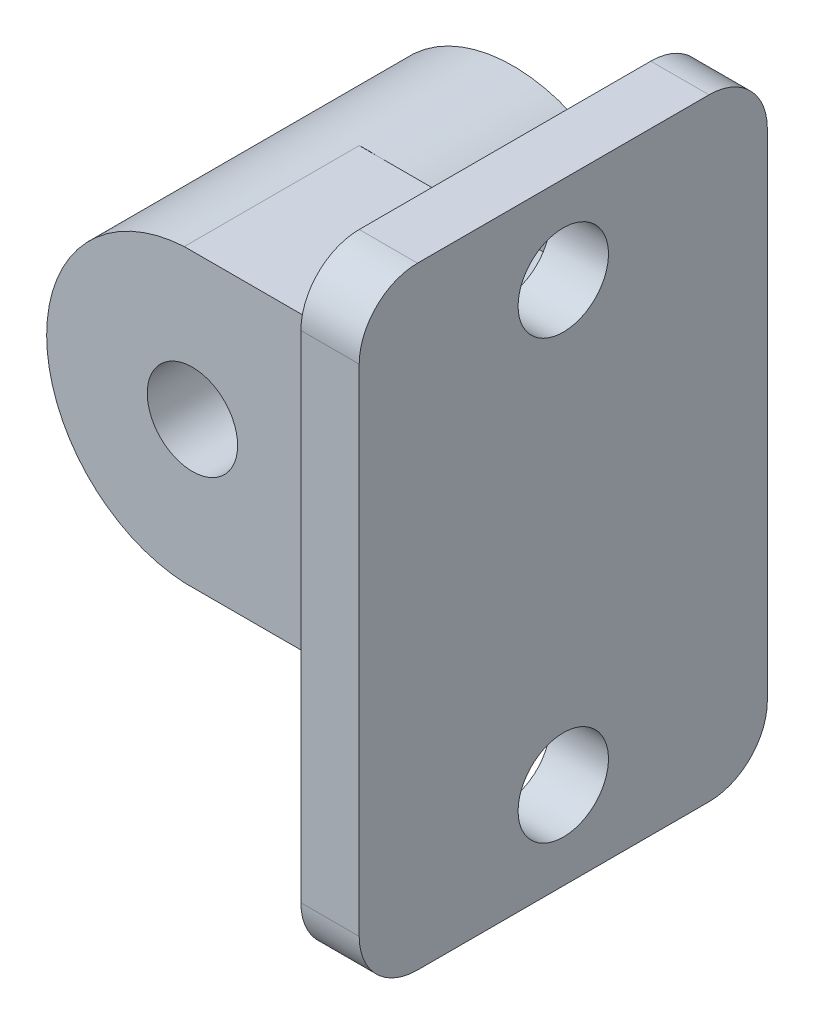
ISO-10303-21;
HEADER;
FILE_DESCRIPTION(('STEP AP214'),'2;1');
FILE_NAME('part.step','',(''),(''),'','','');
FILE_SCHEMA(('AUTOMOTIVE_DESIGN { 1 0 10303 214 1 1 1 1 }'));
ENDSEC;
DATA;
#1=APPLICATION_CONTEXT('core data for automotive mechanical design processes');
#2=APPLICATION_PROTOCOL_DEFINITION('international standard','automotive_design',2000,#1);
#3=PRODUCT_CONTEXT('',#1,'mechanical');
#4=PRODUCT('Part','Part','',(#3));
#5=PRODUCT_RELATED_PRODUCT_CATEGORY('part','',(#4));
#6=PRODUCT_DEFINITION_FORMATION('','',#4);
#7=PRODUCT_DEFINITION_CONTEXT('part definition',#1,'design');
#8=PRODUCT_DEFINITION('design','',#6,#7);
#9=PRODUCT_DEFINITION_SHAPE('','',#8);
#10=(LENGTH_UNIT() NAMED_UNIT(*) SI_UNIT(.MILLI.,.METRE.));
#11=(NAMED_UNIT(*) PLANE_ANGLE_UNIT() SI_UNIT($,.RADIAN.));
#12=(NAMED_UNIT(*) SI_UNIT($,.STERADIAN.) SOLID_ANGLE_UNIT());
#13=UNCERTAINTY_MEASURE_WITH_UNIT(LENGTH_MEASURE(1.E-05),#10,'distance_accuracy_value','');
#14=(GEOMETRIC_REPRESENTATION_CONTEXT(3) GLOBAL_UNCERTAINTY_ASSIGNED_CONTEXT((#13)) GLOBAL_UNIT_ASSIGNED_CONTEXT((#10,
#11,#12)) REPRESENTATION_CONTEXT('',''));
#15=CARTESIAN_POINT('',(0.,0.,0.));
#16=DIRECTION('',(0.,0.,1.));
#17=DIRECTION('',(1.,0.,0.));
#18=AXIS2_PLACEMENT_3D('',#15,#16,#17);
#19=CARTESIAN_POINT('',(0.,0.,-3.));
#20=DIRECTION('',(0.,0.,1.));
#21=DIRECTION('',(1.,0.,0.));
#22=AXIS2_PLACEMENT_3D('',#19,#20,#21);
#23=CYLINDRICAL_SURFACE('',#22,5.00000000000007);
#24=DIRECTION('',(0.,0.,1.));
#25=VECTOR('',#24,1.);
#26=CARTESIAN_POINT('',(-0.27924201066269,-4.99219630017508,-3.));
#27=LINE('',#26,#25);
#28=CARTESIAN_POINT('',(-0.27924201066269,-4.99219630017508,-3.));
#29=VERTEX_POINT('',#28);
#30=CARTESIAN_POINT('',(-0.27924201066269,-4.99219630017508,3.));
#31=VERTEX_POINT('',#30);
#32=EDGE_CURVE('E168',#29,#31,#27,.T.);
#33=ORIENTED_EDGE('',*,*,#32,.T.);
#34=CARTESIAN_POINT('',(0.,0.,3.));
#35=DIRECTION('',(0.,0.,1.));
#36=DIRECTION('',(1.,0.,0.));
#37=AXIS2_PLACEMENT_3D('',#34,#35,#36);
#38=CIRCLE('',#37,5.00000000000007);
#39=CARTESIAN_POINT('',(-0.27924201066269,4.99219630017508,3.));
#40=VERTEX_POINT('',#39);
#41=EDGE_CURVE('E155',#40,#31,#38,.T.);
#42=ORIENTED_EDGE('',*,*,#41,.F.);
#43=DIRECTION('',(0.,0.,1.));
#44=VECTOR('',#43,1.);
#45=CARTESIAN_POINT('',(-0.27924201066269,4.99219630017508,-3.));
#46=LINE('',#45,#44);
#47=CARTESIAN_POINT('',(-0.27924201066269,4.99219630017508,-3.));
#48=VERTEX_POINT('',#47);
#49=EDGE_CURVE('E146',#48,#40,#46,.T.);
#50=ORIENTED_EDGE('',*,*,#49,.F.);
#51=CARTESIAN_POINT('',(0.,0.,-3.));
#52=DIRECTION('',(0.,0.,1.));
#53=DIRECTION('',(1.,0.,0.));
#54=AXIS2_PLACEMENT_3D('',#51,#52,#53);
#55=CIRCLE('',#54,5.00000000000007);
#56=CARTESIAN_POINT('',(0.279242010662767,4.99219630017507,-3.));
#57=VERTEX_POINT('',#56);
#58=EDGE_CURVE('E54',#57,#48,#55,.T.);
#59=ORIENTED_EDGE('',*,*,#58,.F.);
#60=CARTESIAN_POINT('',(0.279242010662767,-4.99219630017507,-3.));
#61=VERTEX_POINT('',#60);
#62=EDGE_CURVE('E141',#61,#57,#55,.T.);
#63=ORIENTED_EDGE('',*,*,#62,.F.);
#64=EDGE_CURVE('E139',#29,#61,#55,.T.);
#65=ORIENTED_EDGE('',*,*,#64,.F.);
#66=EDGE_LOOP('',(#33,#42,#50,#59,#63,#65));
#67=FACE_BOUND('',#66,.T.);
#68=CARTESIAN_POINT('',(0.,0.,-8.));
#69=DIRECTION('',(0.,0.,1.));
#70=DIRECTION('',(1.,0.,0.));
#71=AXIS2_PLACEMENT_3D('',#68,#69,#70);
#72=CIRCLE('',#71,5.00000000000007);
#73=CARTESIAN_POINT('',(5.00000000000007,0.,-8.));
#74=VERTEX_POINT('',#73);
#75=EDGE_CURVE('E138',#74,#74,#72,.T.);
#76=ORIENTED_EDGE('',*,*,#75,.T.);
#77=EDGE_LOOP('',(#76));
#78=FACE_BOUND('',#77,.T.);
#79=ADVANCED_FACE('F39',(#67,#78),#23,.T.);
#80=CARTESIAN_POINT('',(-0.27924201066269,4.99219630017508,-3.));
#81=DIRECTION('',(0.,1.,0.));
#82=DIRECTION('',(-1.,0.,0.));
#83=AXIS2_PLACEMENT_3D('',#80,#81,#82);
#84=PLANE('',#83);
#85=ORIENTED_EDGE('',*,*,#49,.T.);
#86=DIRECTION('',(-1.,0.,0.));
#87=VECTOR('',#86,1.);
#88=CARTESIAN_POINT('',(-0.27924201066269,4.99219630017508,3.));
#89=LINE('',#88,#87);
#90=CARTESIAN_POINT('',(7.72075798933731,4.99219630017501,3.));
#91=VERTEX_POINT('',#90);
#92=EDGE_CURVE('E245',#91,#40,#89,.T.);
#93=ORIENTED_EDGE('',*,*,#92,.F.);
#94=DIRECTION('',(0.,0.,1.));
#95=VECTOR('',#94,1.);
#96=CARTESIAN_POINT('',(7.72075798933731,4.99219630017501,-3.));
#97=LINE('',#96,#95);
#98=CARTESIAN_POINT('',(7.72075798933731,4.99219630017501,-3.));
#99=VERTEX_POINT('',#98);
#100=EDGE_CURVE('E157',#99,#91,#97,.T.);
#101=ORIENTED_EDGE('',*,*,#100,.F.);
#102=DIRECTION('',(-1.,0.,0.));
#103=VECTOR('',#102,1.);
#104=CARTESIAN_POINT('',(-0.27924201066269,4.99219630017508,-3.));
#105=LINE('',#104,#103);
#106=EDGE_CURVE('E149',#99,#57,#105,.T.);
#107=ORIENTED_EDGE('',*,*,#106,.T.);
#108=DIRECTION('',(1.,0.,0.));
#109=VECTOR('',#108,1.);
#110=CARTESIAN_POINT('',(-0.27924201066269,4.99219630017508,-3.));
#111=LINE('',#110,#109);
#112=EDGE_CURVE('E136',#48,#57,#111,.T.);
#113=ORIENTED_EDGE('',*,*,#112,.F.);
#114=EDGE_LOOP('',(#85,#93,#101,#107,#113));
#115=FACE_BOUND('',#114,.T.);
#116=ADVANCED_FACE('F144',(#115),#84,.T.);
#117=CARTESIAN_POINT('',(-0.27924201066269,-4.99219630017508,-3.));
#118=DIRECTION('',(0.,-1.,0.));
#119=DIRECTION('',(1.,0.,0.));
#120=AXIS2_PLACEMENT_3D('',#117,#118,#119);
#121=PLANE('',#120);
#122=DIRECTION('',(0.,0.,1.));
#123=VECTOR('',#122,1.);
#124=CARTESIAN_POINT('',(7.72075798933731,-4.99219630017501,-3.));
#125=LINE('',#124,#123);
#126=CARTESIAN_POINT('',(7.72075798933731,-4.99219630017501,-3.));
#127=VERTEX_POINT('',#126);
#128=CARTESIAN_POINT('',(7.72075798933731,-4.99219630017501,3.));
#129=VERTEX_POINT('',#128);
#130=EDGE_CURVE('E162',#127,#129,#125,.T.);
#131=ORIENTED_EDGE('',*,*,#130,.T.);
#132=DIRECTION('',(1.,0.,0.));
#133=VECTOR('',#132,1.);
#134=CARTESIAN_POINT('',(-0.27924201066269,-4.99219630017508,3.));
#135=LINE('',#134,#133);
#136=EDGE_CURVE('E240',#31,#129,#135,.T.);
#137=ORIENTED_EDGE('',*,*,#136,.F.);
#138=ORIENTED_EDGE('',*,*,#32,.F.);
#139=DIRECTION('',(1.,0.,0.));
#140=VECTOR('',#139,1.);
#141=CARTESIAN_POINT('',(-0.27924201066269,-4.99219630017508,-3.));
#142=LINE('',#141,#140);
#143=EDGE_CURVE('E248',#29,#61,#142,.T.);
#144=ORIENTED_EDGE('',*,*,#143,.T.);
#145=EDGE_CURVE('E247',#61,#127,#142,.T.);
#146=ORIENTED_EDGE('',*,*,#145,.T.);
#147=EDGE_LOOP('',(#131,#137,#138,#144,#146));
#148=FACE_BOUND('',#147,.T.);
#149=ADVANCED_FACE('F265',(#148),#121,.T.);
#150=CARTESIAN_POINT('',(0.,0.,-3.));
#151=DIRECTION('',(0.,0.,1.));
#152=DIRECTION('',(1.,0.,0.));
#153=AXIS2_PLACEMENT_3D('',#150,#151,#152);
#154=PLANE('',#153);
#155=ORIENTED_EDGE('',*,*,#145,.F.);
#156=ORIENTED_EDGE('',*,*,#62,.T.);
#157=ORIENTED_EDGE('',*,*,#106,.F.);
#158=DIRECTION('',(0.,1.,0.));
#159=VECTOR('',#158,1.);
#160=CARTESIAN_POINT('',(7.72075798933731,4.99219630017501,-3.));
#161=LINE('',#160,#159);
#162=EDGE_CURVE('E250',#127,#99,#161,.T.);
#163=ORIENTED_EDGE('',*,*,#162,.F.);
#164=EDGE_LOOP('',(#155,#156,#157,#163));
#165=FACE_BOUND('',#164,.T.);
#166=ADVANCED_FACE('F258',(#165),#154,.F.);
#167=CARTESIAN_POINT('',(0.,0.,-3.));
#168=DIRECTION('',(0.,0.,1.));
#169=DIRECTION('',(1.,0.,0.));
#170=AXIS2_PLACEMENT_3D('',#167,#168,#169);
#171=CYLINDRICAL_SURFACE('',#170,1.55);
#172=CARTESIAN_POINT('',(0.,0.,3.));
#173=DIRECTION('',(0.,0.,1.));
#174=DIRECTION('',(1.,0.,0.));
#175=AXIS2_PLACEMENT_3D('',#172,#173,#174);
#176=CIRCLE('',#175,1.55);
#177=CARTESIAN_POINT('',(1.55,0.,3.));
#178=VERTEX_POINT('',#177);
#179=EDGE_CURVE('E235',#178,#178,#176,.T.);
#180=ORIENTED_EDGE('',*,*,#179,.T.);
#181=EDGE_LOOP('',(#180));
#182=FACE_BOUND('',#181,.T.);
#183=CARTESIAN_POINT('',(0.,0.,-8.));
#184=DIRECTION('',(0.,0.,1.));
#185=DIRECTION('',(1.,0.,0.));
#186=AXIS2_PLACEMENT_3D('',#183,#184,#185);
#187=CIRCLE('',#186,1.55);
#188=CARTESIAN_POINT('',(1.55,0.,-8.));
#189=VERTEX_POINT('',#188);
#190=EDGE_CURVE('E270',#189,#189,#187,.T.);
#191=ORIENTED_EDGE('',*,*,#190,.F.);
#192=EDGE_LOOP('',(#191));
#193=FACE_BOUND('',#192,.T.);
#194=ADVANCED_FACE('F327',(#182,#193),#171,.F.);
#195=CARTESIAN_POINT('',(0.,0.,3.));
#196=DIRECTION('',(0.,0.,1.));
#197=DIRECTION('',(1.,0.,0.));
#198=AXIS2_PLACEMENT_3D('',#195,#196,#197);
#199=PLANE('',#198);
#200=ORIENTED_EDGE('',*,*,#41,.T.);
#201=ORIENTED_EDGE('',*,*,#136,.T.);
#202=DIRECTION('',(0.,1.,0.));
#203=VECTOR('',#202,1.);
#204=CARTESIAN_POINT('',(7.72075798933731,4.99219630017501,3.));
#205=LINE('',#204,#203);
#206=EDGE_CURVE('E243',#129,#91,#205,.T.);
#207=ORIENTED_EDGE('',*,*,#206,.T.);
#208=ORIENTED_EDGE('',*,*,#92,.T.);
#209=EDGE_LOOP('',(#200,#201,#207,#208));
#210=FACE_BOUND('',#209,.T.);
#211=ORIENTED_EDGE('',*,*,#179,.F.);
#212=EDGE_LOOP('',(#211));
#213=FACE_BOUND('',#212,.T.);
#214=ADVANCED_FACE('F260',(#210,#213),#199,.T.);
#215=CARTESIAN_POINT('',(9.72075798933731,-10.5,-7.));
#216=DIRECTION('',(0.,0.,1.));
#217=DIRECTION('',(1.,0.,0.));
#218=AXIS2_PLACEMENT_3D('',#215,#216,#217);
#219=PLANE('',#218);
#220=DIRECTION('',(0.,1.,0.));
#221=VECTOR('',#220,1.);
#222=CARTESIAN_POINT('',(9.72075798933731,-10.5,-7.));
#223=LINE('',#222,#221);
#224=CARTESIAN_POINT('',(9.72075798933731,-8.5,-7.));
#225=VERTEX_POINT('',#224);
#226=CARTESIAN_POINT('',(9.72075798933731,8.5,-7.));
#227=VERTEX_POINT('',#226);
#228=EDGE_CURVE('E202',#225,#227,#223,.T.);
#229=ORIENTED_EDGE('',*,*,#228,.F.);
#230=DIRECTION('',(-1.,0.,0.));
#231=VECTOR('',#230,1.);
#232=CARTESIAN_POINT('',(9.72075798933731,-8.5,-7.));
#233=LINE('',#232,#231);
#234=CARTESIAN_POINT('',(7.72075798933731,-8.5,-7.));
#235=VERTEX_POINT('',#234);
#236=EDGE_CURVE('E12',#225,#235,#233,.T.);
#237=ORIENTED_EDGE('',*,*,#236,.T.);
#238=DIRECTION('',(0.,1.,0.));
#239=VECTOR('',#238,1.);
#240=CARTESIAN_POINT('',(7.72075798933731,-10.5,-7.));
#241=LINE('',#240,#239);
#242=CARTESIAN_POINT('',(7.72075798933731,8.5,-7.));
#243=VERTEX_POINT('',#242);
#244=EDGE_CURVE('E205',#235,#243,#241,.T.);
#245=ORIENTED_EDGE('',*,*,#244,.T.);
#246=DIRECTION('',(-1.,0.,0.));
#247=VECTOR('',#246,1.);
#248=CARTESIAN_POINT('',(9.72075798933731,8.50000000000001,-7.));
#249=LINE('',#248,#247);
#250=EDGE_CURVE('E47',#243,#227,#249,.F.);
#251=ORIENTED_EDGE('',*,*,#250,.T.);
#252=EDGE_LOOP('',(#229,#237,#245,#251));
#253=FACE_BOUND('',#252,.T.);
#254=ADVANCED_FACE('F201',(#253),#219,.F.);
#255=CARTESIAN_POINT('',(9.72075798933731,10.5,7.));
#256=DIRECTION('',(0.,-1.,0.));
#257=DIRECTION('',(0.,0.,-1.));
#258=AXIS2_PLACEMENT_3D('',#255,#256,#257);
#259=PLANE('',#258);
#260=DIRECTION('',(0.,0.,1.));
#261=VECTOR('',#260,1.);
#262=CARTESIAN_POINT('',(7.72075798933731,10.5,7.));
#263=LINE('',#262,#261);
#264=CARTESIAN_POINT('',(7.72075798933731,10.5,-5.));
#265=VERTEX_POINT('',#264);
#266=CARTESIAN_POINT('',(7.72075798933731,10.5,5.));
#267=VERTEX_POINT('',#266);
#268=EDGE_CURVE('E221',#265,#267,#263,.T.);
#269=ORIENTED_EDGE('',*,*,#268,.T.);
#270=DIRECTION('',(-1.,0.,0.));
#271=VECTOR('',#270,1.);
#272=CARTESIAN_POINT('',(9.72075798933731,10.5,5.));
#273=LINE('',#272,#271);
#274=CARTESIAN_POINT('',(9.72075798933731,10.5,5.));
#275=VERTEX_POINT('',#274);
#276=EDGE_CURVE('E183',#267,#275,#273,.F.);
#277=ORIENTED_EDGE('',*,*,#276,.T.);
#278=DIRECTION('',(0.,0.,1.));
#279=VECTOR('',#278,1.);
#280=CARTESIAN_POINT('',(9.72075798933731,10.5,7.));
#281=LINE('',#280,#279);
#282=CARTESIAN_POINT('',(9.72075798933731,10.5,-5.));
#283=VERTEX_POINT('',#282);
#284=EDGE_CURVE('E213',#283,#275,#281,.T.);
#285=ORIENTED_EDGE('',*,*,#284,.F.);
#286=DIRECTION('',(-1.,0.,0.));
#287=VECTOR('',#286,1.);
#288=CARTESIAN_POINT('',(9.72075798933731,10.5,-5.));
#289=LINE('',#288,#287);
#290=EDGE_CURVE('E180',#283,#265,#289,.T.);
#291=ORIENTED_EDGE('',*,*,#290,.T.);
#292=EDGE_LOOP('',(#269,#277,#285,#291));
#293=FACE_BOUND('',#292,.T.);
#294=ADVANCED_FACE('F220',(#293),#259,.F.);
#295=CARTESIAN_POINT('',(9.72075798933731,-10.5,7.));
#296=DIRECTION('',(0.,0.,-1.));
#297=DIRECTION('',(-1.,0.,0.));
#298=AXIS2_PLACEMENT_3D('',#295,#296,#297);
#299=PLANE('',#298);
#300=DIRECTION('',(0.,-1.,0.));
#301=VECTOR('',#300,1.);
#302=CARTESIAN_POINT('',(9.72075798933731,-10.5,7.));
#303=LINE('',#302,#301);
#304=CARTESIAN_POINT('',(9.72075798933731,8.5,7.));
#305=VERTEX_POINT('',#304);
#306=CARTESIAN_POINT('',(9.72075798933731,-8.5,7.));
#307=VERTEX_POINT('',#306);
#308=EDGE_CURVE('E285',#305,#307,#303,.T.);
#309=ORIENTED_EDGE('',*,*,#308,.F.);
#310=DIRECTION('',(-1.,0.,0.));
#311=VECTOR('',#310,1.);
#312=CARTESIAN_POINT('',(9.72075798933731,8.50000000000001,7.));
#313=LINE('',#312,#311);
#314=CARTESIAN_POINT('',(7.72075798933731,8.5,7.));
#315=VERTEX_POINT('',#314);
#316=EDGE_CURVE('E159',#305,#315,#313,.T.);
#317=ORIENTED_EDGE('',*,*,#316,.T.);
#318=DIRECTION('',(0.,-1.,0.));
#319=VECTOR('',#318,1.);
#320=CARTESIAN_POINT('',(7.72075798933731,-10.5,7.));
#321=LINE('',#320,#319);
#322=CARTESIAN_POINT('',(7.72075798933731,-8.5,7.));
#323=VERTEX_POINT('',#322);
#324=EDGE_CURVE('E226',#315,#323,#321,.T.);
#325=ORIENTED_EDGE('',*,*,#324,.T.);
#326=DIRECTION('',(-1.,0.,0.));
#327=VECTOR('',#326,1.);
#328=CARTESIAN_POINT('',(9.72075798933731,-8.5,7.));
#329=LINE('',#328,#327);
#330=EDGE_CURVE('E156',#323,#307,#329,.F.);
#331=ORIENTED_EDGE('',*,*,#330,.T.);
#332=EDGE_LOOP('',(#309,#317,#325,#331));
#333=FACE_BOUND('',#332,.T.);
#334=ADVANCED_FACE('F298',(#333),#299,.F.);
#335=CARTESIAN_POINT('',(9.72075798933731,-10.5,7.));
#336=DIRECTION('',(0.,1.,0.));
#337=DIRECTION('',(0.,0.,1.));
#338=AXIS2_PLACEMENT_3D('',#335,#336,#337);
#339=PLANE('',#338);
#340=DIRECTION('',(0.,0.,-1.));
#341=VECTOR('',#340,1.);
#342=CARTESIAN_POINT('',(9.72075798933731,-10.5,7.));
#343=LINE('',#342,#341);
#344=CARTESIAN_POINT('',(9.72075798933731,-10.5,5.));
#345=VERTEX_POINT('',#344);
#346=CARTESIAN_POINT('',(9.72075798933731,-10.5,-5.));
#347=VERTEX_POINT('',#346);
#348=EDGE_CURVE('E238',#345,#347,#343,.T.);
#349=ORIENTED_EDGE('',*,*,#348,.F.);
#350=DIRECTION('',(-1.,0.,0.));
#351=VECTOR('',#350,1.);
#352=CARTESIAN_POINT('',(9.72075798933731,-10.5,5.));
#353=LINE('',#352,#351);
#354=CARTESIAN_POINT('',(7.72075798933731,-10.5,5.));
#355=VERTEX_POINT('',#354);
#356=EDGE_CURVE('E194',#345,#355,#353,.T.);
#357=ORIENTED_EDGE('',*,*,#356,.T.);
#358=DIRECTION('',(0.,0.,-1.));
#359=VECTOR('',#358,1.);
#360=CARTESIAN_POINT('',(7.72075798933731,-10.5,7.));
#361=LINE('',#360,#359);
#362=CARTESIAN_POINT('',(7.72075798933731,-10.5,-5.));
#363=VERTEX_POINT('',#362);
#364=EDGE_CURVE('E214',#355,#363,#361,.T.);
#365=ORIENTED_EDGE('',*,*,#364,.T.);
#366=DIRECTION('',(-1.,0.,0.));
#367=VECTOR('',#366,1.);
#368=CARTESIAN_POINT('',(9.72075798933731,-10.5,-5.));
#369=LINE('',#368,#367);
#370=EDGE_CURVE('E62',#363,#347,#369,.F.);
#371=ORIENTED_EDGE('',*,*,#370,.T.);
#372=EDGE_LOOP('',(#349,#357,#365,#371));
#373=FACE_BOUND('',#372,.T.);
#374=ADVANCED_FACE('F292',(#373),#339,.F.);
#375=CARTESIAN_POINT('',(9.72075798933731,0.,0.));
#376=DIRECTION('',(-1.,0.,0.));
#377=DIRECTION('',(0.,0.,1.));
#378=AXIS2_PLACEMENT_3D('',#375,#376,#377);
#379=PLANE('',#378);
#380=CARTESIAN_POINT('',(9.72075798933731,7.5,0.));
#381=DIRECTION('',(-1.,0.,0.));
#382=DIRECTION('',(0.,0.,1.));
#383=AXIS2_PLACEMENT_3D('',#380,#381,#382);
#384=CIRCLE('',#383,1.55);
#385=CARTESIAN_POINT('',(9.72075798933731,7.5,1.55));
#386=VERTEX_POINT('',#385);
#387=EDGE_CURVE('E230',#386,#386,#384,.F.);
#388=ORIENTED_EDGE('',*,*,#387,.F.);
#389=EDGE_LOOP('',(#388));
#390=FACE_BOUND('',#389,.T.);
#391=CARTESIAN_POINT('',(9.72075798933731,-7.5,0.));
#392=DIRECTION('',(-1.,0.,0.));
#393=DIRECTION('',(0.,0.,1.));
#394=AXIS2_PLACEMENT_3D('',#391,#392,#393);
#395=CIRCLE('',#394,1.55);
#396=CARTESIAN_POINT('',(9.72075798933731,-7.5,1.55));
#397=VERTEX_POINT('',#396);
#398=EDGE_CURVE('E277',#397,#397,#395,.F.);
#399=ORIENTED_EDGE('',*,*,#398,.F.);
#400=EDGE_LOOP('',(#399));
#401=FACE_BOUND('',#400,.T.);
#402=ORIENTED_EDGE('',*,*,#284,.T.);
#403=CARTESIAN_POINT('',(9.72075798933731,8.50000000000001,5.));
#404=DIRECTION('',(-1.,0.,0.));
#405=DIRECTION('',(0.,0.,1.));
#406=AXIS2_PLACEMENT_3D('',#403,#404,#405);
#407=CIRCLE('',#406,2.);
#408=EDGE_CURVE('E191',#275,#305,#407,.F.);
#409=ORIENTED_EDGE('',*,*,#408,.T.);
#410=ORIENTED_EDGE('',*,*,#308,.T.);
#411=CARTESIAN_POINT('',(9.72075798933731,-8.5,5.));
#412=DIRECTION('',(-1.,0.,0.));
#413=DIRECTION('',(0.,0.,1.));
#414=AXIS2_PLACEMENT_3D('',#411,#412,#413);
#415=CIRCLE('',#414,2.);
#416=EDGE_CURVE('E189',#307,#345,#415,.F.);
#417=ORIENTED_EDGE('',*,*,#416,.T.);
#418=ORIENTED_EDGE('',*,*,#348,.T.);
#419=CARTESIAN_POINT('',(9.72075798933731,-8.5,-5.));
#420=DIRECTION('',(-1.,0.,0.));
#421=DIRECTION('',(0.,0.,1.));
#422=AXIS2_PLACEMENT_3D('',#419,#420,#421);
#423=CIRCLE('',#422,2.);
#424=EDGE_CURVE('E187',#347,#225,#423,.F.);
#425=ORIENTED_EDGE('',*,*,#424,.T.);
#426=ORIENTED_EDGE('',*,*,#228,.T.);
#427=CARTESIAN_POINT('',(9.72075798933731,8.5,-5.));
#428=DIRECTION('',(-1.,0.,0.));
#429=DIRECTION('',(0.,0.,1.));
#430=AXIS2_PLACEMENT_3D('',#427,#428,#429);
#431=CIRCLE('',#430,2.);
#432=EDGE_CURVE('E185',#227,#283,#431,.F.);
#433=ORIENTED_EDGE('',*,*,#432,.T.);
#434=EDGE_LOOP('',(#402,#409,#410,#417,#418,#425,#426,#433));
#435=FACE_BOUND('',#434,.T.);
#436=ADVANCED_FACE('F210',(#390,#401,#435),#379,.F.);
#437=CARTESIAN_POINT('',(7.72075798933731,0.,0.));
#438=DIRECTION('',(-1.,0.,0.));
#439=DIRECTION('',(0.,0.,1.));
#440=AXIS2_PLACEMENT_3D('',#437,#438,#439);
#441=PLANE('',#440);
#442=CARTESIAN_POINT('',(7.72075798933731,7.5,0.));
#443=DIRECTION('',(-1.,0.,0.));
#444=DIRECTION('',(0.,0.,1.));
#445=AXIS2_PLACEMENT_3D('',#442,#443,#444);
#446=CIRCLE('',#445,1.55);
#447=CARTESIAN_POINT('',(7.72075798933731,7.5,1.55));
#448=VERTEX_POINT('',#447);
#449=EDGE_CURVE('E274',#448,#448,#446,.T.);
#450=ORIENTED_EDGE('',*,*,#449,.F.);
#451=EDGE_LOOP('',(#450));
#452=FACE_BOUND('',#451,.T.);
#453=CARTESIAN_POINT('',(7.72075798933731,-7.5,0.));
#454=DIRECTION('',(-1.,0.,0.));
#455=DIRECTION('',(0.,0.,-1.));
#456=AXIS2_PLACEMENT_3D('',#453,#454,#455);
#457=CIRCLE('',#456,1.55);
#458=CARTESIAN_POINT('',(7.72075798933731,-7.5,-1.55));
#459=VERTEX_POINT('',#458);
#460=EDGE_CURVE('E150',#459,#459,#457,.T.);
#461=ORIENTED_EDGE('',*,*,#460,.F.);
#462=EDGE_LOOP('',(#461));
#463=FACE_BOUND('',#462,.T.);
#464=ORIENTED_EDGE('',*,*,#162,.T.);
#465=ORIENTED_EDGE('',*,*,#100,.T.);
#466=ORIENTED_EDGE('',*,*,#206,.F.);
#467=ORIENTED_EDGE('',*,*,#130,.F.);
#468=EDGE_LOOP('',(#464,#465,#466,#467));
#469=FACE_BOUND('',#468,.T.);
#470=ORIENTED_EDGE('',*,*,#324,.F.);
#471=CARTESIAN_POINT('',(7.72075798933731,8.50000000000001,5.));
#472=DIRECTION('',(-1.,0.,0.));
#473=DIRECTION('',(0.,0.,1.));
#474=AXIS2_PLACEMENT_3D('',#471,#472,#473);
#475=CIRCLE('',#474,2.);
#476=EDGE_CURVE('E178',#315,#267,#475,.T.);
#477=ORIENTED_EDGE('',*,*,#476,.T.);
#478=ORIENTED_EDGE('',*,*,#268,.F.);
#479=CARTESIAN_POINT('',(7.72075798933731,8.5,-5.));
#480=DIRECTION('',(-1.,0.,0.));
#481=DIRECTION('',(0.,0.,1.));
#482=AXIS2_PLACEMENT_3D('',#479,#480,#481);
#483=CIRCLE('',#482,2.);
#484=EDGE_CURVE('E172',#265,#243,#483,.T.);
#485=ORIENTED_EDGE('',*,*,#484,.T.);
#486=ORIENTED_EDGE('',*,*,#244,.F.);
#487=CARTESIAN_POINT('',(7.72075798933731,-8.5,-5.));
#488=DIRECTION('',(-1.,0.,0.));
#489=DIRECTION('',(0.,0.,1.));
#490=AXIS2_PLACEMENT_3D('',#487,#488,#489);
#491=CIRCLE('',#490,2.);
#492=EDGE_CURVE('E174',#235,#363,#491,.T.);
#493=ORIENTED_EDGE('',*,*,#492,.T.);
#494=ORIENTED_EDGE('',*,*,#364,.F.);
#495=CARTESIAN_POINT('',(7.72075798933731,-8.5,5.));
#496=DIRECTION('',(-1.,0.,0.));
#497=DIRECTION('',(0.,0.,1.));
#498=AXIS2_PLACEMENT_3D('',#495,#496,#497);
#499=CIRCLE('',#498,2.);
#500=EDGE_CURVE('E176',#355,#323,#499,.T.);
#501=ORIENTED_EDGE('',*,*,#500,.T.);
#502=EDGE_LOOP('',(#470,#477,#478,#485,#486,#493,#494,#501));
#503=FACE_BOUND('',#502,.T.);
#504=ADVANCED_FACE('F225',(#452,#463,#469,#503),#441,.T.);
#505=CARTESIAN_POINT('',(14.1048200326939,-7.5,0.));
#506=DIRECTION('',(-1.,0.,0.));
#507=DIRECTION('',(0.,0.,1.));
#508=AXIS2_PLACEMENT_3D('',#505,#506,#507);
#509=CYLINDRICAL_SURFACE('',#508,1.55);
#510=ORIENTED_EDGE('',*,*,#398,.T.);
#511=EDGE_LOOP('',(#510));
#512=FACE_BOUND('',#511,.T.);
#513=ORIENTED_EDGE('',*,*,#460,.T.);
#514=EDGE_LOOP('',(#513));
#515=FACE_BOUND('',#514,.T.);
#516=ADVANCED_FACE('F311',(#512,#515),#509,.F.);
#517=CARTESIAN_POINT('',(14.1048200326939,7.5,0.));
#518=DIRECTION('',(-1.,0.,0.));
#519=DIRECTION('',(0.,0.,1.));
#520=AXIS2_PLACEMENT_3D('',#517,#518,#519);
#521=CYLINDRICAL_SURFACE('',#520,1.55);
#522=ORIENTED_EDGE('',*,*,#387,.T.);
#523=EDGE_LOOP('',(#522));
#524=FACE_BOUND('',#523,.T.);
#525=ORIENTED_EDGE('',*,*,#449,.T.);
#526=EDGE_LOOP('',(#525));
#527=FACE_BOUND('',#526,.T.);
#528=ADVANCED_FACE('F304',(#524,#527),#521,.F.);
#529=CARTESIAN_POINT('',(9.72075798933731,8.50000000000001,5.));
#530=DIRECTION('',(-1.,0.,0.));
#531=DIRECTION('',(0.,0.,1.));
#532=AXIS2_PLACEMENT_3D('',#529,#530,#531);
#533=CYLINDRICAL_SURFACE('',#532,2.);
#534=ORIENTED_EDGE('',*,*,#408,.F.);
#535=ORIENTED_EDGE('',*,*,#276,.F.);
#536=ORIENTED_EDGE('',*,*,#476,.F.);
#537=ORIENTED_EDGE('',*,*,#316,.F.);
#538=EDGE_LOOP('',(#534,#535,#536,#537));
#539=FACE_BOUND('',#538,.T.);
#540=ADVANCED_FACE('F302',(#539),#533,.T.);
#541=CARTESIAN_POINT('',(9.72075798933731,-8.5,5.));
#542=DIRECTION('',(-1.,0.,0.));
#543=DIRECTION('',(0.,0.,1.));
#544=AXIS2_PLACEMENT_3D('',#541,#542,#543);
#545=CYLINDRICAL_SURFACE('',#544,2.);
#546=ORIENTED_EDGE('',*,*,#416,.F.);
#547=ORIENTED_EDGE('',*,*,#330,.F.);
#548=ORIENTED_EDGE('',*,*,#500,.F.);
#549=ORIENTED_EDGE('',*,*,#356,.F.);
#550=EDGE_LOOP('',(#546,#547,#548,#549));
#551=FACE_BOUND('',#550,.T.);
#552=ADVANCED_FACE('F294',(#551),#545,.T.);
#553=CARTESIAN_POINT('',(9.72075798933731,-8.5,-5.));
#554=DIRECTION('',(-1.,0.,0.));
#555=DIRECTION('',(0.,0.,1.));
#556=AXIS2_PLACEMENT_3D('',#553,#554,#555);
#557=CYLINDRICAL_SURFACE('',#556,2.);
#558=ORIENTED_EDGE('',*,*,#424,.F.);
#559=ORIENTED_EDGE('',*,*,#370,.F.);
#560=ORIENTED_EDGE('',*,*,#492,.F.);
#561=ORIENTED_EDGE('',*,*,#236,.F.);
#562=EDGE_LOOP('',(#558,#559,#560,#561));
#563=FACE_BOUND('',#562,.T.);
#564=ADVANCED_FACE('F290',(#563),#557,.T.);
#565=CARTESIAN_POINT('',(9.72075798933731,8.5,-5.));
#566=DIRECTION('',(-1.,0.,0.));
#567=DIRECTION('',(0.,0.,1.));
#568=AXIS2_PLACEMENT_3D('',#565,#566,#567);
#569=CYLINDRICAL_SURFACE('',#568,2.);
#570=ORIENTED_EDGE('',*,*,#432,.F.);
#571=ORIENTED_EDGE('',*,*,#250,.F.);
#572=ORIENTED_EDGE('',*,*,#484,.F.);
#573=ORIENTED_EDGE('',*,*,#290,.F.);
#574=EDGE_LOOP('',(#570,#571,#572,#573));
#575=FACE_BOUND('',#574,.T.);
#576=ADVANCED_FACE('F41',(#575),#569,.T.);
#577=CARTESIAN_POINT('',(0.,0.,-3.));
#578=DIRECTION('',(0.,0.,1.));
#579=DIRECTION('',(1.,0.,0.));
#580=AXIS2_PLACEMENT_3D('',#577,#578,#579);
#581=PLANE('',#580);
#582=ORIENTED_EDGE('',*,*,#58,.T.);
#583=ORIENTED_EDGE('',*,*,#112,.T.);
#584=EDGE_LOOP('',(#582,#583));
#585=FACE_BOUND('',#584,.T.);
#586=ADVANCED_FACE('F135',(#585),#581,.T.);
#587=CARTESIAN_POINT('',(0.,0.,-8.));
#588=DIRECTION('',(0.,0.,1.));
#589=DIRECTION('',(1.,0.,0.));
#590=AXIS2_PLACEMENT_3D('',#587,#588,#589);
#591=PLANE('',#590);
#592=ORIENTED_EDGE('',*,*,#190,.T.);
#593=EDGE_LOOP('',(#592));
#594=FACE_BOUND('',#593,.T.);
#595=ORIENTED_EDGE('',*,*,#75,.F.);
#596=EDGE_LOOP('',(#595));
#597=FACE_BOUND('',#596,.T.);
#598=ADVANCED_FACE('F351',(#594,#597),#591,.F.);
#599=ORIENTED_EDGE('',*,*,#64,.T.);
#600=ORIENTED_EDGE('',*,*,#143,.F.);
#601=EDGE_LOOP('',(#599,#600));
#602=FACE_BOUND('',#601,.T.);
#603=ADVANCED_FACE('F269',(#602),#581,.T.);
#604=CLOSED_SHELL('',(#79,#116,#149,#166,#194,#214,#254,#294,#334,#374,#436,#504,#516,#528,#540,
#552,#564,#576,#586,#598,#603));
#605=MANIFOLD_SOLID_BREP('B2',#604);
#606=ADVANCED_BREP_SHAPE_REPRESENTATION('',(#18,#605),#14);
#607=SHAPE_DEFINITION_REPRESENTATION(#9,#606);
ENDSEC;
END-ISO-10303-21;
